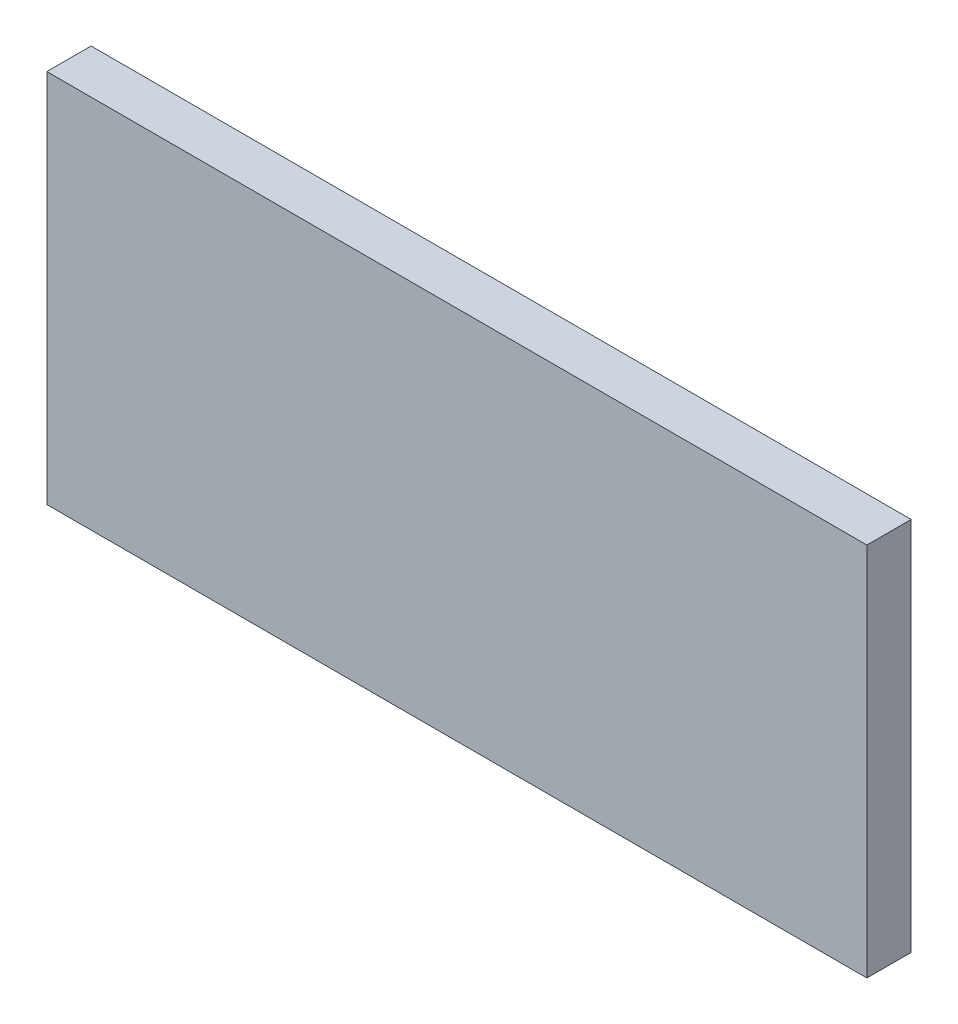
ISO-10303-21;
HEADER;
FILE_DESCRIPTION(('STEP AP214'),'2;1');
FILE_NAME('part.step','',(''),(''),'','','');
FILE_SCHEMA(('AUTOMOTIVE_DESIGN { 1 0 10303 214 1 1 1 1 }'));
ENDSEC;
DATA;
#1=APPLICATION_CONTEXT('core data for automotive mechanical design processes');
#2=APPLICATION_PROTOCOL_DEFINITION('international standard','automotive_design',2000,#1);
#3=PRODUCT_CONTEXT('',#1,'mechanical');
#4=PRODUCT('Part','Part','',(#3));
#5=PRODUCT_RELATED_PRODUCT_CATEGORY('part','',(#4));
#6=PRODUCT_DEFINITION_FORMATION('','',#4);
#7=PRODUCT_DEFINITION_CONTEXT('part definition',#1,'design');
#8=PRODUCT_DEFINITION('design','',#6,#7);
#9=PRODUCT_DEFINITION_SHAPE('','',#8);
#10=(LENGTH_UNIT() NAMED_UNIT(*) SI_UNIT(.MILLI.,.METRE.));
#11=(NAMED_UNIT(*) PLANE_ANGLE_UNIT() SI_UNIT($,.RADIAN.));
#12=(NAMED_UNIT(*) SI_UNIT($,.STERADIAN.) SOLID_ANGLE_UNIT());
#13=UNCERTAINTY_MEASURE_WITH_UNIT(LENGTH_MEASURE(1.E-05),#10,'distance_accuracy_value','');
#14=(GEOMETRIC_REPRESENTATION_CONTEXT(3) GLOBAL_UNCERTAINTY_ASSIGNED_CONTEXT((#13)) GLOBAL_UNIT_ASSIGNED_CONTEXT((#10,
#11,#12)) REPRESENTATION_CONTEXT('',''));
#15=CARTESIAN_POINT('',(0.,0.,0.));
#16=DIRECTION('',(0.,0.,1.));
#17=DIRECTION('',(1.,0.,0.));
#18=AXIS2_PLACEMENT_3D('',#15,#16,#17);
#19=CARTESIAN_POINT('',(-11.1099981,-5.08,0.));
#20=DIRECTION('',(0.,0.,1.));
#21=DIRECTION('',(1.,0.,0.));
#22=AXIS2_PLACEMENT_3D('',#19,#20,#21);
#23=PLANE('',#22);
#24=DIRECTION('',(0.,1.,0.));
#25=VECTOR('',#24,1.);
#26=CARTESIAN_POINT('',(11.11000064,5.08,0.));
#27=LINE('',#26,#25);
#28=CARTESIAN_POINT('',(11.11000064,-5.08,0.));
#29=VERTEX_POINT('',#28);
#30=CARTESIAN_POINT('',(11.11000064,5.08,0.));
#31=VERTEX_POINT('',#30);
#32=EDGE_CURVE('E80',#29,#31,#27,.T.);
#33=ORIENTED_EDGE('',*,*,#32,.F.);
#34=DIRECTION('',(1.,0.,0.));
#35=VECTOR('',#34,1.);
#36=CARTESIAN_POINT('',(11.11000064,-5.08,0.));
#37=LINE('',#36,#35);
#38=CARTESIAN_POINT('',(-11.1099981,-5.08,0.));
#39=VERTEX_POINT('',#38);
#40=EDGE_CURVE('E68',#39,#29,#37,.T.);
#41=ORIENTED_EDGE('',*,*,#40,.F.);
#42=DIRECTION('',(0.,1.,0.));
#43=VECTOR('',#42,1.);
#44=CARTESIAN_POINT('',(-11.1099981,-5.08,0.));
#45=LINE('',#44,#43);
#46=CARTESIAN_POINT('',(-11.1099981,5.08,0.));
#47=VERTEX_POINT('',#46);
#48=EDGE_CURVE('E55',#47,#39,#45,.F.);
#49=ORIENTED_EDGE('',*,*,#48,.F.);
#50=DIRECTION('',(1.,0.,0.));
#51=VECTOR('',#50,1.);
#52=CARTESIAN_POINT('',(-11.1099981,5.08,0.));
#53=LINE('',#52,#51);
#54=EDGE_CURVE('E20',#31,#47,#53,.F.);
#55=ORIENTED_EDGE('',*,*,#54,.F.);
#56=EDGE_LOOP('',(#33,#41,#49,#55));
#57=FACE_BOUND('',#56,.T.);
#58=ADVANCED_FACE('F17',(#57),#23,.F.);
#59=CARTESIAN_POINT('',(-11.1099981,5.08,0.));
#60=DIRECTION('',(0.,1.,0.));
#61=DIRECTION('',(0.,0.,1.));
#62=AXIS2_PLACEMENT_3D('',#59,#60,#61);
#63=PLANE('',#62);
#64=DIRECTION('',(0.,0.,1.));
#65=VECTOR('',#64,1.);
#66=CARTESIAN_POINT('',(-11.1099981,5.08,0.));
#67=LINE('',#66,#65);
#68=CARTESIAN_POINT('',(-11.1099981,5.08,1.2));
#69=VERTEX_POINT('',#68);
#70=EDGE_CURVE('E61',#69,#47,#67,.F.);
#71=ORIENTED_EDGE('',*,*,#70,.F.);
#72=DIRECTION('',(1.,0.,0.));
#73=VECTOR('',#72,1.);
#74=CARTESIAN_POINT('',(-11.1099981,5.08,1.2));
#75=LINE('',#74,#73);
#76=CARTESIAN_POINT('',(11.11000064,5.08,1.2));
#77=VERTEX_POINT('',#76);
#78=EDGE_CURVE('E83',#77,#69,#75,.F.);
#79=ORIENTED_EDGE('',*,*,#78,.F.);
#80=DIRECTION('',(0.,0.,-1.));
#81=VECTOR('',#80,1.);
#82=CARTESIAN_POINT('',(11.11000064,5.08,0.));
#83=LINE('',#82,#81);
#84=EDGE_CURVE('E64',#31,#77,#83,.F.);
#85=ORIENTED_EDGE('',*,*,#84,.F.);
#86=ORIENTED_EDGE('',*,*,#54,.T.);
#87=EDGE_LOOP('',(#71,#79,#85,#86));
#88=FACE_BOUND('',#87,.T.);
#89=ADVANCED_FACE('F60',(#88),#63,.T.);
#90=CARTESIAN_POINT('',(-11.1099981,-5.08,0.));
#91=DIRECTION('',(-1.,0.,0.));
#92=DIRECTION('',(0.,0.,1.));
#93=AXIS2_PLACEMENT_3D('',#90,#91,#92);
#94=PLANE('',#93);
#95=DIRECTION('',(0.,0.,-1.));
#96=VECTOR('',#95,1.);
#97=CARTESIAN_POINT('',(-11.1099981,-5.08,0.));
#98=LINE('',#97,#96);
#99=CARTESIAN_POINT('',(-11.1099981,-5.08,1.2));
#100=VERTEX_POINT('',#99);
#101=EDGE_CURVE('E70',#100,#39,#98,.T.);
#102=ORIENTED_EDGE('',*,*,#101,.F.);
#103=DIRECTION('',(0.,1.,0.));
#104=VECTOR('',#103,1.);
#105=CARTESIAN_POINT('',(-11.1099981,-5.08,1.2));
#106=LINE('',#105,#104);
#107=EDGE_CURVE('E74',#69,#100,#106,.F.);
#108=ORIENTED_EDGE('',*,*,#107,.F.);
#109=ORIENTED_EDGE('',*,*,#70,.T.);
#110=ORIENTED_EDGE('',*,*,#48,.T.);
#111=EDGE_LOOP('',(#102,#108,#109,#110));
#112=FACE_BOUND('',#111,.T.);
#113=ADVANCED_FACE('F72',(#112),#94,.T.);
#114=CARTESIAN_POINT('',(11.11000064,-5.08,0.));
#115=DIRECTION('',(0.,-1.,0.));
#116=DIRECTION('',(0.,0.,-1.));
#117=AXIS2_PLACEMENT_3D('',#114,#115,#116);
#118=PLANE('',#117);
#119=DIRECTION('',(0.,0.,-1.));
#120=VECTOR('',#119,1.);
#121=CARTESIAN_POINT('',(11.11000064,-5.08,0.));
#122=LINE('',#121,#120);
#123=CARTESIAN_POINT('',(11.11000064,-5.08,1.2));
#124=VERTEX_POINT('',#123);
#125=EDGE_CURVE('E35',#124,#29,#122,.T.);
#126=ORIENTED_EDGE('',*,*,#125,.F.);
#127=DIRECTION('',(1.,0.,0.));
#128=VECTOR('',#127,1.);
#129=CARTESIAN_POINT('',(-11.1099981,-5.08,1.2));
#130=LINE('',#129,#128);
#131=EDGE_CURVE('E26',#100,#124,#130,.T.);
#132=ORIENTED_EDGE('',*,*,#131,.F.);
#133=ORIENTED_EDGE('',*,*,#101,.T.);
#134=ORIENTED_EDGE('',*,*,#40,.T.);
#135=EDGE_LOOP('',(#126,#132,#133,#134));
#136=FACE_BOUND('',#135,.T.);
#137=ADVANCED_FACE('F89',(#136),#118,.T.);
#138=CARTESIAN_POINT('',(11.11000064,5.08,0.));
#139=DIRECTION('',(1.,0.,0.));
#140=DIRECTION('',(0.,0.,-1.));
#141=AXIS2_PLACEMENT_3D('',#138,#139,#140);
#142=PLANE('',#141);
#143=ORIENTED_EDGE('',*,*,#84,.T.);
#144=DIRECTION('',(0.,1.,0.));
#145=VECTOR('',#144,1.);
#146=CARTESIAN_POINT('',(11.11000064,-5.08,1.2));
#147=LINE('',#146,#145);
#148=EDGE_CURVE('E11',#124,#77,#147,.T.);
#149=ORIENTED_EDGE('',*,*,#148,.F.);
#150=ORIENTED_EDGE('',*,*,#125,.T.);
#151=ORIENTED_EDGE('',*,*,#32,.T.);
#152=EDGE_LOOP('',(#143,#149,#150,#151));
#153=FACE_BOUND('',#152,.T.);
#154=ADVANCED_FACE('F91',(#153),#142,.T.);
#155=CARTESIAN_POINT('',(-11.1099981,-5.08,1.2));
#156=DIRECTION('',(0.,0.,1.));
#157=DIRECTION('',(1.,0.,0.));
#158=AXIS2_PLACEMENT_3D('',#155,#156,#157);
#159=PLANE('',#158);
#160=ORIENTED_EDGE('',*,*,#131,.T.);
#161=ORIENTED_EDGE('',*,*,#148,.T.);
#162=ORIENTED_EDGE('',*,*,#78,.T.);
#163=ORIENTED_EDGE('',*,*,#107,.T.);
#164=EDGE_LOOP('',(#160,#161,#162,#163));
#165=FACE_BOUND('',#164,.T.);
#166=ADVANCED_FACE('F88',(#165),#159,.T.);
#167=CLOSED_SHELL('',(#58,#89,#113,#137,#154,#166));
#168=MANIFOLD_SOLID_BREP('B1',#167);
#169=ADVANCED_BREP_SHAPE_REPRESENTATION('',(#18,#168),#14);
#170=SHAPE_DEFINITION_REPRESENTATION(#9,#169);
ENDSEC;
END-ISO-10303-21;
